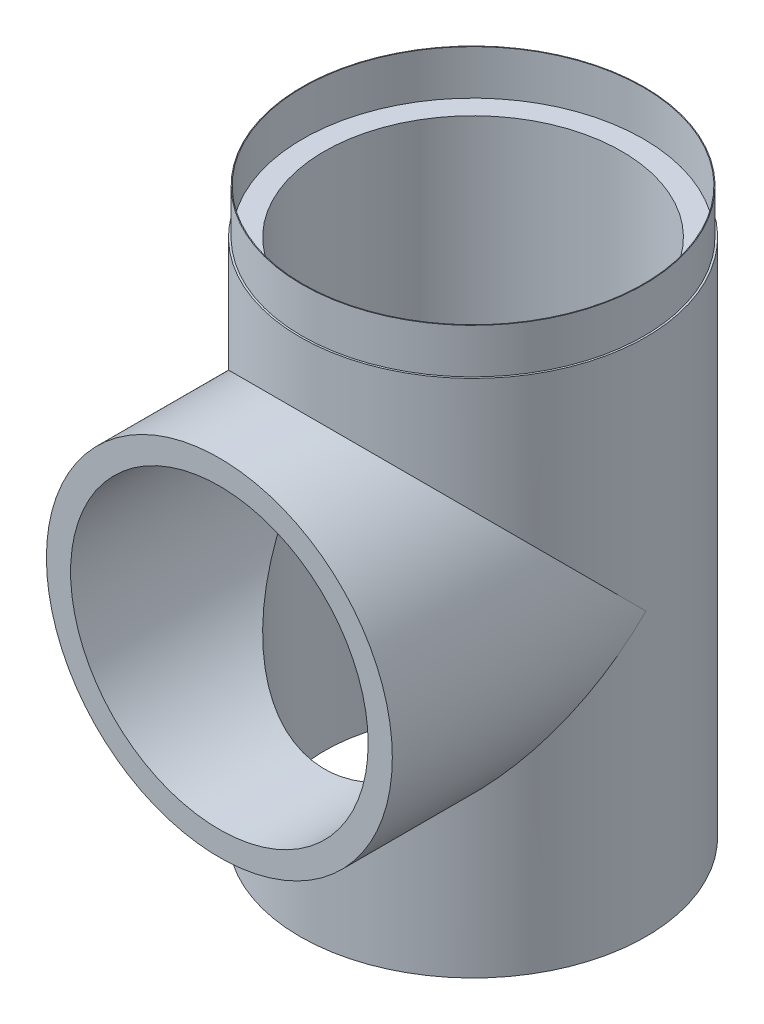
ISO-10303-21;
HEADER;
FILE_DESCRIPTION(('STEP AP214'),'2;1');
FILE_NAME('part.step','',(''),(''),'','','');
FILE_SCHEMA(('AUTOMOTIVE_DESIGN { 1 0 10303 214 1 1 1 1 }'));
ENDSEC;
DATA;
#1=APPLICATION_CONTEXT('core data for automotive mechanical design processes');
#2=APPLICATION_PROTOCOL_DEFINITION('international standard','automotive_design',2000,#1);
#3=PRODUCT_CONTEXT('',#1,'mechanical');
#4=PRODUCT('Part','Part','',(#3));
#5=PRODUCT_RELATED_PRODUCT_CATEGORY('part','',(#4));
#6=PRODUCT_DEFINITION_FORMATION('','',#4);
#7=PRODUCT_DEFINITION_CONTEXT('part definition',#1,'design');
#8=PRODUCT_DEFINITION('design','',#6,#7);
#9=PRODUCT_DEFINITION_SHAPE('','',#8);
#10=(LENGTH_UNIT() NAMED_UNIT(*) SI_UNIT(.MILLI.,.METRE.));
#11=(NAMED_UNIT(*) PLANE_ANGLE_UNIT() SI_UNIT($,.RADIAN.));
#12=(NAMED_UNIT(*) SI_UNIT($,.STERADIAN.) SOLID_ANGLE_UNIT());
#13=UNCERTAINTY_MEASURE_WITH_UNIT(LENGTH_MEASURE(1.E-05),#10,'distance_accuracy_value','');
#14=(GEOMETRIC_REPRESENTATION_CONTEXT(3) GLOBAL_UNCERTAINTY_ASSIGNED_CONTEXT((#13)) GLOBAL_UNIT_ASSIGNED_CONTEXT((#10,
#11,#12)) REPRESENTATION_CONTEXT('',''));
#15=CARTESIAN_POINT('',(0.,0.,0.));
#16=DIRECTION('',(0.,0.,1.));
#17=DIRECTION('',(1.,0.,0.));
#18=AXIS2_PLACEMENT_3D('',#15,#16,#17);
#19=CARTESIAN_POINT('',(0.,698.,0.));
#20=DIRECTION('',(0.,-1.,0.));
#21=DIRECTION('',(0.,0.,-1.));
#22=AXIS2_PLACEMENT_3D('',#19,#20,#21);
#23=CYLINDRICAL_SURFACE('',#22,232.5);
#24=CARTESIAN_POINT('',(0.,698.,0.));
#25=DIRECTION('',(0.,1.,0.));
#26=DIRECTION('',(0.,0.,1.));
#27=AXIS2_PLACEMENT_3D('',#24,#25,#26);
#28=CIRCLE('',#27,232.5);
#29=CARTESIAN_POINT('',(0.,698.,232.5));
#30=VERTEX_POINT('',#29);
#31=EDGE_CURVE('E93',#30,#30,#28,.T.);
#32=ORIENTED_EDGE('',*,*,#31,.F.);
#33=EDGE_LOOP('',(#32));
#34=FACE_BOUND('',#33,.T.);
#35=CARTESIAN_POINT('',(0.,0.,0.));
#36=DIRECTION('',(0.,1.,0.));
#37=DIRECTION('',(0.,0.,1.));
#38=AXIS2_PLACEMENT_3D('',#35,#36,#37);
#39=CIRCLE('',#38,232.5);
#40=CARTESIAN_POINT('',(0.,0.,232.5));
#41=VERTEX_POINT('',#40);
#42=EDGE_CURVE('E90',#41,#41,#39,.T.);
#43=ORIENTED_EDGE('',*,*,#42,.T.);
#44=EDGE_LOOP('',(#43));
#45=FACE_BOUND('',#44,.T.);
#46=CARTESIAN_POINT('',(0.,379.,0.));
#47=DIRECTION('',(0.,-0.707106781186548,-0.707106781186547));
#48=DIRECTION('',(0.,-0.707106781186548,0.707106781186547));
#49=AXIS2_PLACEMENT_3D('',#46,#47,#48);
#50=ELLIPSE('',#49,328.804653251745,232.5);
#51=CARTESIAN_POINT('',(-232.5,379.,0.));
#52=VERTEX_POINT('',#51);
#53=CARTESIAN_POINT('',(232.5,379.,0.));
#54=VERTEX_POINT('',#53);
#55=EDGE_CURVE('E75',#52,#54,#50,.F.);
#56=ORIENTED_EDGE('',*,*,#55,.F.);
#57=CARTESIAN_POINT('',(0.,379.,0.));
#58=DIRECTION('',(0.,-0.707106781186548,0.707106781186547));
#59=DIRECTION('',(0.,-0.707106781186548,-0.707106781186547));
#60=AXIS2_PLACEMENT_3D('',#57,#58,#59);
#61=ELLIPSE('',#60,328.804653251745,232.5);
#62=EDGE_CURVE('E50',#54,#52,#61,.T.);
#63=ORIENTED_EDGE('',*,*,#62,.F.);
#64=EDGE_LOOP('',(#56,#63));
#65=FACE_BOUND('',#64,.T.);
#66=ADVANCED_FACE('F32',(#34,#45,#65),#23,.T.);
#67=CARTESIAN_POINT('',(0.,698.,0.));
#68=DIRECTION('',(0.,-1.,0.));
#69=DIRECTION('',(0.,0.,-1.));
#70=AXIS2_PLACEMENT_3D('',#67,#68,#69);
#71=CYLINDRICAL_SURFACE('',#70,200.);
#72=CARTESIAN_POINT('',(0.,379.,0.));
#73=DIRECTION('',(0.,-0.707106781186548,-0.707106781186547));
#74=DIRECTION('',(0.,0.707106781186548,-0.707106781186547));
#75=AXIS2_PLACEMENT_3D('',#72,#73,#74);
#76=ELLIPSE('',#75,282.842712474619,200.);
#77=CARTESIAN_POINT('',(-200.,379.,0.));
#78=VERTEX_POINT('',#77);
#79=CARTESIAN_POINT('',(200.,379.,0.));
#80=VERTEX_POINT('',#79);
#81=EDGE_CURVE('E39',#78,#80,#76,.F.);
#82=ORIENTED_EDGE('',*,*,#81,.T.);
#83=CARTESIAN_POINT('',(0.,379.,0.));
#84=DIRECTION('',(0.,0.707106781186548,-0.707106781186547));
#85=DIRECTION('',(0.,-0.707106781186548,-0.707106781186547));
#86=AXIS2_PLACEMENT_3D('',#83,#84,#85);
#87=ELLIPSE('',#86,282.842712474619,200.);
#88=EDGE_CURVE('E11',#80,#78,#87,.F.);
#89=ORIENTED_EDGE('',*,*,#88,.T.);
#90=EDGE_LOOP('',(#82,#89));
#91=FACE_BOUND('',#90,.T.);
#92=CARTESIAN_POINT('',(0.,0.,0.));
#93=DIRECTION('',(0.,1.,0.));
#94=DIRECTION('',(0.,0.,1.));
#95=AXIS2_PLACEMENT_3D('',#92,#93,#94);
#96=CIRCLE('',#95,200.);
#97=CARTESIAN_POINT('',(0.,0.,200.));
#98=VERTEX_POINT('',#97);
#99=EDGE_CURVE('E84',#98,#98,#96,.T.);
#100=ORIENTED_EDGE('',*,*,#99,.F.);
#101=EDGE_LOOP('',(#100));
#102=FACE_BOUND('',#101,.T.);
#103=CARTESIAN_POINT('',(0.,698.,0.));
#104=DIRECTION('',(0.,1.,0.));
#105=DIRECTION('',(0.,0.,1.));
#106=AXIS2_PLACEMENT_3D('',#103,#104,#105);
#107=CIRCLE('',#106,200.);
#108=CARTESIAN_POINT('',(0.,698.,200.));
#109=VERTEX_POINT('',#108);
#110=EDGE_CURVE('E87',#109,#109,#107,.T.);
#111=ORIENTED_EDGE('',*,*,#110,.T.);
#112=EDGE_LOOP('',(#111));
#113=FACE_BOUND('',#112,.T.);
#114=ADVANCED_FACE('F55',(#91,#102,#113),#71,.F.);
#115=CARTESIAN_POINT('',(0.,698.,0.));
#116=DIRECTION('',(0.,1.,0.));
#117=DIRECTION('',(0.,0.,1.));
#118=AXIS2_PLACEMENT_3D('',#115,#116,#117);
#119=PLANE('',#118);
#120=ORIENTED_EDGE('',*,*,#31,.T.);
#121=EDGE_LOOP('',(#120));
#122=FACE_BOUND('',#121,.T.);
#123=CARTESIAN_POINT('',(0.,698.,0.));
#124=DIRECTION('',(0.,1.,0.));
#125=DIRECTION('',(0.,0.,1.));
#126=AXIS2_PLACEMENT_3D('',#123,#124,#125);
#127=CIRCLE('',#126,230.);
#128=CARTESIAN_POINT('',(0.,698.,230.));
#129=VERTEX_POINT('',#128);
#130=EDGE_CURVE('E80',#129,#129,#127,.T.);
#131=ORIENTED_EDGE('',*,*,#130,.F.);
#132=EDGE_LOOP('',(#131));
#133=FACE_BOUND('',#132,.T.);
#134=ADVANCED_FACE('F107',(#122,#133),#119,.T.);
#135=CARTESIAN_POINT('',(0.,698.,0.));
#136=DIRECTION('',(0.,1.,0.));
#137=DIRECTION('',(0.,0.,1.));
#138=AXIS2_PLACEMENT_3D('',#135,#136,#137);
#139=CIRCLE('',#138,229.);
#140=CARTESIAN_POINT('',(0.,698.,229.));
#141=VERTEX_POINT('',#140);
#142=EDGE_CURVE('E58',#141,#141,#139,.F.);
#143=ORIENTED_EDGE('',*,*,#142,.F.);
#144=EDGE_LOOP('',(#143));
#145=FACE_BOUND('',#144,.T.);
#146=ORIENTED_EDGE('',*,*,#110,.F.);
#147=EDGE_LOOP('',(#146));
#148=FACE_BOUND('',#147,.T.);
#149=ADVANCED_FACE('F103',(#145,#148),#119,.T.);
#150=CARTESIAN_POINT('',(0.,0.,0.));
#151=DIRECTION('',(0.,1.,0.));
#152=DIRECTION('',(0.,0.,1.));
#153=AXIS2_PLACEMENT_3D('',#150,#151,#152);
#154=PLANE('',#153);
#155=ORIENTED_EDGE('',*,*,#42,.F.);
#156=EDGE_LOOP('',(#155));
#157=FACE_BOUND('',#156,.T.);
#158=ORIENTED_EDGE('',*,*,#99,.T.);
#159=EDGE_LOOP('',(#158));
#160=FACE_BOUND('',#159,.T.);
#161=ADVANCED_FACE('F106',(#157,#160),#154,.F.);
#162=CARTESIAN_POINT('',(0.,758.,0.));
#163=DIRECTION('',(0.,1.,0.));
#164=DIRECTION('',(0.,0.,1.));
#165=AXIS2_PLACEMENT_3D('',#162,#163,#164);
#166=PLANE('',#165);
#167=CARTESIAN_POINT('',(0.,758.,0.));
#168=DIRECTION('',(0.,1.,0.));
#169=DIRECTION('',(0.,0.,1.));
#170=AXIS2_PLACEMENT_3D('',#167,#168,#169);
#171=CIRCLE('',#170,230.);
#172=CARTESIAN_POINT('',(0.,758.,230.));
#173=VERTEX_POINT('',#172);
#174=EDGE_CURVE('E81',#173,#173,#171,.T.);
#175=ORIENTED_EDGE('',*,*,#174,.T.);
#176=EDGE_LOOP('',(#175));
#177=FACE_BOUND('',#176,.T.);
#178=CARTESIAN_POINT('',(0.,758.,0.));
#179=DIRECTION('',(0.,1.,0.));
#180=DIRECTION('',(0.,0.,1.));
#181=AXIS2_PLACEMENT_3D('',#178,#179,#180);
#182=CIRCLE('',#181,229.);
#183=CARTESIAN_POINT('',(0.,758.,229.));
#184=VERTEX_POINT('',#183);
#185=EDGE_CURVE('E77',#184,#184,#182,.T.);
#186=ORIENTED_EDGE('',*,*,#185,.F.);
#187=EDGE_LOOP('',(#186));
#188=FACE_BOUND('',#187,.T.);
#189=ADVANCED_FACE('F123',(#177,#188),#166,.T.);
#190=CARTESIAN_POINT('',(0.,758.,0.));
#191=DIRECTION('',(0.,-1.,0.));
#192=DIRECTION('',(0.,0.,-1.));
#193=AXIS2_PLACEMENT_3D('',#190,#191,#192);
#194=CYLINDRICAL_SURFACE('',#193,230.);
#195=ORIENTED_EDGE('',*,*,#174,.F.);
#196=EDGE_LOOP('',(#195));
#197=FACE_BOUND('',#196,.T.);
#198=ORIENTED_EDGE('',*,*,#130,.T.);
#199=EDGE_LOOP('',(#198));
#200=FACE_BOUND('',#199,.T.);
#201=ADVANCED_FACE('F120',(#197,#200),#194,.T.);
#202=CARTESIAN_POINT('',(0.,758.,0.));
#203=DIRECTION('',(0.,-1.,0.));
#204=DIRECTION('',(0.,0.,-1.));
#205=AXIS2_PLACEMENT_3D('',#202,#203,#204);
#206=CYLINDRICAL_SURFACE('',#205,229.);
#207=ORIENTED_EDGE('',*,*,#185,.T.);
#208=EDGE_LOOP('',(#207));
#209=FACE_BOUND('',#208,.T.);
#210=ORIENTED_EDGE('',*,*,#142,.T.);
#211=EDGE_LOOP('',(#210));
#212=FACE_BOUND('',#211,.T.);
#213=ADVANCED_FACE('F101',(#209,#212),#206,.F.);
#214=CARTESIAN_POINT('',(0.,379.,341.));
#215=DIRECTION('',(0.,0.,-1.));
#216=DIRECTION('',(-1.,0.,0.));
#217=AXIS2_PLACEMENT_3D('',#214,#215,#216);
#218=CYLINDRICAL_SURFACE('',#217,232.5);
#219=CARTESIAN_POINT('',(0.,379.,341.));
#220=DIRECTION('',(0.,0.,1.));
#221=DIRECTION('',(1.,0.,0.));
#222=AXIS2_PLACEMENT_3D('',#219,#220,#221);
#223=CIRCLE('',#222,232.5);
#224=CARTESIAN_POINT('',(232.5,379.,341.));
#225=VERTEX_POINT('',#224);
#226=EDGE_CURVE('E69',#225,#225,#223,.T.);
#227=ORIENTED_EDGE('',*,*,#226,.F.);
#228=EDGE_LOOP('',(#227));
#229=FACE_BOUND('',#228,.T.);
#230=ORIENTED_EDGE('',*,*,#62,.T.);
#231=ORIENTED_EDGE('',*,*,#55,.T.);
#232=EDGE_LOOP('',(#230,#231));
#233=FACE_BOUND('',#232,.T.);
#234=ADVANCED_FACE('F63',(#229,#233),#218,.T.);
#235=CARTESIAN_POINT('',(0.,379.,341.));
#236=DIRECTION('',(0.,0.,-1.));
#237=DIRECTION('',(-1.,0.,0.));
#238=AXIS2_PLACEMENT_3D('',#235,#236,#237);
#239=CYLINDRICAL_SURFACE('',#238,200.);
#240=ORIENTED_EDGE('',*,*,#88,.F.);
#241=ORIENTED_EDGE('',*,*,#81,.F.);
#242=EDGE_LOOP('',(#240,#241));
#243=FACE_BOUND('',#242,.T.);
#244=CARTESIAN_POINT('',(0.,379.,341.));
#245=DIRECTION('',(0.,0.,1.));
#246=DIRECTION('',(1.,0.,0.));
#247=AXIS2_PLACEMENT_3D('',#244,#245,#246);
#248=CIRCLE('',#247,200.);
#249=CARTESIAN_POINT('',(200.,379.,341.));
#250=VERTEX_POINT('',#249);
#251=EDGE_CURVE('E67',#250,#250,#248,.T.);
#252=ORIENTED_EDGE('',*,*,#251,.T.);
#253=EDGE_LOOP('',(#252));
#254=FACE_BOUND('',#253,.T.);
#255=ADVANCED_FACE('F59',(#243,#254),#239,.F.);
#256=CARTESIAN_POINT('',(0.,379.,341.));
#257=DIRECTION('',(0.,0.,1.));
#258=DIRECTION('',(1.,0.,0.));
#259=AXIS2_PLACEMENT_3D('',#256,#257,#258);
#260=PLANE('',#259);
#261=ORIENTED_EDGE('',*,*,#226,.T.);
#262=EDGE_LOOP('',(#261));
#263=FACE_BOUND('',#262,.T.);
#264=ORIENTED_EDGE('',*,*,#251,.F.);
#265=EDGE_LOOP('',(#264));
#266=FACE_BOUND('',#265,.T.);
#267=ADVANCED_FACE('F62',(#263,#266),#260,.T.);
#268=CLOSED_SHELL('',(#66,#114,#134,#149,#161,#189,#201,#213,#234,#255,#267));
#269=MANIFOLD_SOLID_BREP('B2',#268);
#270=ADVANCED_BREP_SHAPE_REPRESENTATION('',(#18,#269),#14);
#271=SHAPE_DEFINITION_REPRESENTATION(#9,#270);
ENDSEC;
END-ISO-10303-21;
